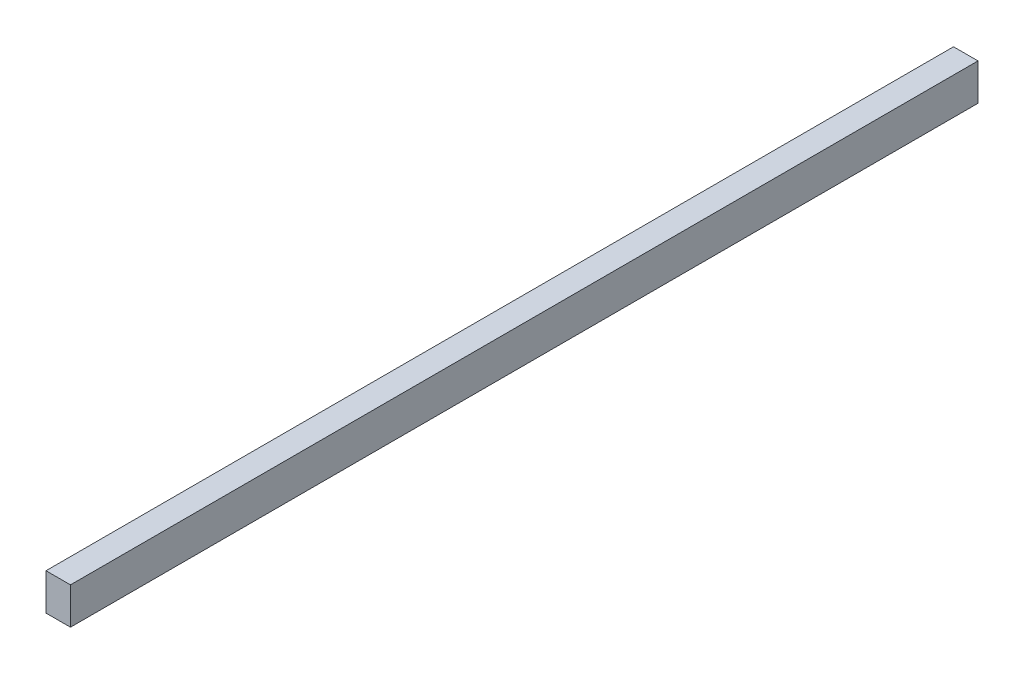
ISO-10303-21;
HEADER;
FILE_DESCRIPTION(('STEP AP214'),'2;1');
FILE_NAME('part.step','',(''),(''),'','','');
FILE_SCHEMA(('AUTOMOTIVE_DESIGN { 1 0 10303 214 1 1 1 1 }'));
ENDSEC;
DATA;
#1=APPLICATION_CONTEXT('core data for automotive mechanical design processes');
#2=APPLICATION_PROTOCOL_DEFINITION('international standard','automotive_design',2000,#1);
#3=PRODUCT_CONTEXT('',#1,'mechanical');
#4=PRODUCT('Part','Part','',(#3));
#5=PRODUCT_RELATED_PRODUCT_CATEGORY('part','',(#4));
#6=PRODUCT_DEFINITION_FORMATION('','',#4);
#7=PRODUCT_DEFINITION_CONTEXT('part definition',#1,'design');
#8=PRODUCT_DEFINITION('design','',#6,#7);
#9=PRODUCT_DEFINITION_SHAPE('','',#8);
#10=(LENGTH_UNIT() NAMED_UNIT(*) SI_UNIT(.MILLI.,.METRE.));
#11=(NAMED_UNIT(*) PLANE_ANGLE_UNIT() SI_UNIT($,.RADIAN.));
#12=(NAMED_UNIT(*) SI_UNIT($,.STERADIAN.) SOLID_ANGLE_UNIT());
#13=UNCERTAINTY_MEASURE_WITH_UNIT(LENGTH_MEASURE(1.E-05),#10,'distance_accuracy_value','');
#14=(GEOMETRIC_REPRESENTATION_CONTEXT(3) GLOBAL_UNCERTAINTY_ASSIGNED_CONTEXT((#13)) GLOBAL_UNIT_ASSIGNED_CONTEXT((#10,
#11,#12)) REPRESENTATION_CONTEXT('',''));
#15=CARTESIAN_POINT('',(0.,0.,0.));
#16=DIRECTION('',(0.,0.,1.));
#17=DIRECTION('',(1.,0.,0.));
#18=AXIS2_PLACEMENT_3D('',#15,#16,#17);
#19=CARTESIAN_POINT('',(12.,0.,0.));
#20=DIRECTION('',(0.,0.,-1.));
#21=DIRECTION('',(-1.,0.,0.));
#22=AXIS2_PLACEMENT_3D('',#19,#20,#21);
#23=PLANE('',#22);
#24=DIRECTION('',(0.,-1.,0.));
#25=VECTOR('',#24,1.);
#26=CARTESIAN_POINT('',(0.,0.,0.));
#27=LINE('',#26,#25);
#28=CARTESIAN_POINT('',(0.,18.,0.));
#29=VERTEX_POINT('',#28);
#30=CARTESIAN_POINT('',(0.,0.,0.));
#31=VERTEX_POINT('',#30);
#32=EDGE_CURVE('E96',#29,#31,#27,.T.);
#33=ORIENTED_EDGE('',*,*,#32,.T.);
#34=DIRECTION('',(-1.,0.,0.));
#35=VECTOR('',#34,1.);
#36=CARTESIAN_POINT('',(12.,0.,0.));
#37=LINE('',#36,#35);
#38=CARTESIAN_POINT('',(12.,0.,0.));
#39=VERTEX_POINT('',#38);
#40=EDGE_CURVE('E11',#39,#31,#37,.T.);
#41=ORIENTED_EDGE('',*,*,#40,.F.);
#42=DIRECTION('',(0.,-1.,0.));
#43=VECTOR('',#42,1.);
#44=CARTESIAN_POINT('',(12.,0.,0.));
#45=LINE('',#44,#43);
#46=CARTESIAN_POINT('',(12.,18.,0.));
#47=VERTEX_POINT('',#46);
#48=EDGE_CURVE('E84',#47,#39,#45,.T.);
#49=ORIENTED_EDGE('',*,*,#48,.F.);
#50=DIRECTION('',(-1.,0.,0.));
#51=VECTOR('',#50,1.);
#52=CARTESIAN_POINT('',(12.,18.,0.));
#53=LINE('',#52,#51);
#54=EDGE_CURVE('E92',#47,#29,#53,.T.);
#55=ORIENTED_EDGE('',*,*,#54,.T.);
#56=EDGE_LOOP('',(#33,#41,#49,#55));
#57=FACE_BOUND('',#56,.T.);
#58=ADVANCED_FACE('F33',(#57),#23,.F.);
#59=CARTESIAN_POINT('',(12.,0.,0.));
#60=DIRECTION('',(0.,1.,0.));
#61=DIRECTION('',(0.,0.,1.));
#62=AXIS2_PLACEMENT_3D('',#59,#60,#61);
#63=PLANE('',#62);
#64=DIRECTION('',(0.,0.,-1.));
#65=VECTOR('',#64,1.);
#66=CARTESIAN_POINT('',(0.,0.,0.));
#67=LINE('',#66,#65);
#68=CARTESIAN_POINT('',(0.,0.,-445.));
#69=VERTEX_POINT('',#68);
#70=EDGE_CURVE('E88',#31,#69,#67,.T.);
#71=ORIENTED_EDGE('',*,*,#70,.T.);
#72=DIRECTION('',(-1.,0.,0.));
#73=VECTOR('',#72,1.);
#74=CARTESIAN_POINT('',(12.,0.,-445.));
#75=LINE('',#74,#73);
#76=CARTESIAN_POINT('',(12.,0.,-445.));
#77=VERTEX_POINT('',#76);
#78=EDGE_CURVE('E41',#77,#69,#75,.T.);
#79=ORIENTED_EDGE('',*,*,#78,.F.);
#80=DIRECTION('',(0.,0.,-1.));
#81=VECTOR('',#80,1.);
#82=CARTESIAN_POINT('',(12.,0.,0.));
#83=LINE('',#82,#81);
#84=EDGE_CURVE('E79',#39,#77,#83,.T.);
#85=ORIENTED_EDGE('',*,*,#84,.F.);
#86=ORIENTED_EDGE('',*,*,#40,.T.);
#87=EDGE_LOOP('',(#71,#79,#85,#86));
#88=FACE_BOUND('',#87,.T.);
#89=ADVANCED_FACE('F87',(#88),#63,.F.);
#90=CARTESIAN_POINT('',(12.,0.,-445.));
#91=DIRECTION('',(0.,0.,1.));
#92=DIRECTION('',(1.,0.,0.));
#93=AXIS2_PLACEMENT_3D('',#90,#91,#92);
#94=PLANE('',#93);
#95=DIRECTION('',(0.,1.,0.));
#96=VECTOR('',#95,1.);
#97=CARTESIAN_POINT('',(0.,0.,-445.));
#98=LINE('',#97,#96);
#99=CARTESIAN_POINT('',(0.,18.,-445.));
#100=VERTEX_POINT('',#99);
#101=EDGE_CURVE('E66',#69,#100,#98,.T.);
#102=ORIENTED_EDGE('',*,*,#101,.T.);
#103=DIRECTION('',(-1.,0.,0.));
#104=VECTOR('',#103,1.);
#105=CARTESIAN_POINT('',(12.,18.,-445.));
#106=LINE('',#105,#104);
#107=CARTESIAN_POINT('',(12.,18.,-445.));
#108=VERTEX_POINT('',#107);
#109=EDGE_CURVE('E89',#108,#100,#106,.T.);
#110=ORIENTED_EDGE('',*,*,#109,.F.);
#111=DIRECTION('',(0.,1.,0.));
#112=VECTOR('',#111,1.);
#113=CARTESIAN_POINT('',(12.,0.,-445.));
#114=LINE('',#113,#112);
#115=EDGE_CURVE('E82',#77,#108,#114,.T.);
#116=ORIENTED_EDGE('',*,*,#115,.F.);
#117=ORIENTED_EDGE('',*,*,#78,.T.);
#118=EDGE_LOOP('',(#102,#110,#116,#117));
#119=FACE_BOUND('',#118,.T.);
#120=ADVANCED_FACE('F90',(#119),#94,.F.);
#121=CARTESIAN_POINT('',(12.,18.,0.));
#122=DIRECTION('',(0.,-1.,0.));
#123=DIRECTION('',(0.,0.,-1.));
#124=AXIS2_PLACEMENT_3D('',#121,#122,#123);
#125=PLANE('',#124);
#126=DIRECTION('',(0.,0.,1.));
#127=VECTOR('',#126,1.);
#128=CARTESIAN_POINT('',(0.,18.,0.));
#129=LINE('',#128,#127);
#130=EDGE_CURVE('E72',#100,#29,#129,.T.);
#131=ORIENTED_EDGE('',*,*,#130,.T.);
#132=ORIENTED_EDGE('',*,*,#54,.F.);
#133=DIRECTION('',(0.,0.,1.));
#134=VECTOR('',#133,1.);
#135=CARTESIAN_POINT('',(12.,18.,0.));
#136=LINE('',#135,#134);
#137=EDGE_CURVE('E49',#108,#47,#136,.T.);
#138=ORIENTED_EDGE('',*,*,#137,.F.);
#139=ORIENTED_EDGE('',*,*,#109,.T.);
#140=EDGE_LOOP('',(#131,#132,#138,#139));
#141=FACE_BOUND('',#140,.T.);
#142=ADVANCED_FACE('F103',(#141),#125,.F.);
#143=CARTESIAN_POINT('',(12.,0.,0.));
#144=DIRECTION('',(-1.,0.,0.));
#145=DIRECTION('',(0.,0.,1.));
#146=AXIS2_PLACEMENT_3D('',#143,#144,#145);
#147=PLANE('',#146);
#148=ORIENTED_EDGE('',*,*,#48,.T.);
#149=ORIENTED_EDGE('',*,*,#84,.T.);
#150=ORIENTED_EDGE('',*,*,#115,.T.);
#151=ORIENTED_EDGE('',*,*,#137,.T.);
#152=EDGE_LOOP('',(#148,#149,#150,#151));
#153=FACE_BOUND('',#152,.T.);
#154=ADVANCED_FACE('F80',(#153),#147,.F.);
#155=CARTESIAN_POINT('',(0.,0.,0.));
#156=DIRECTION('',(-1.,0.,0.));
#157=DIRECTION('',(0.,0.,1.));
#158=AXIS2_PLACEMENT_3D('',#155,#156,#157);
#159=PLANE('',#158);
#160=ORIENTED_EDGE('',*,*,#32,.F.);
#161=ORIENTED_EDGE('',*,*,#130,.F.);
#162=ORIENTED_EDGE('',*,*,#101,.F.);
#163=ORIENTED_EDGE('',*,*,#70,.F.);
#164=EDGE_LOOP('',(#160,#161,#162,#163));
#165=FACE_BOUND('',#164,.T.);
#166=ADVANCED_FACE('F106',(#165),#159,.T.);
#167=CLOSED_SHELL('',(#58,#89,#120,#142,#154,#166));
#168=MANIFOLD_SOLID_BREP('B2',#167);
#169=ADVANCED_BREP_SHAPE_REPRESENTATION('',(#18,#168),#14);
#170=SHAPE_DEFINITION_REPRESENTATION(#9,#169);
ENDSEC;
END-ISO-10303-21;
